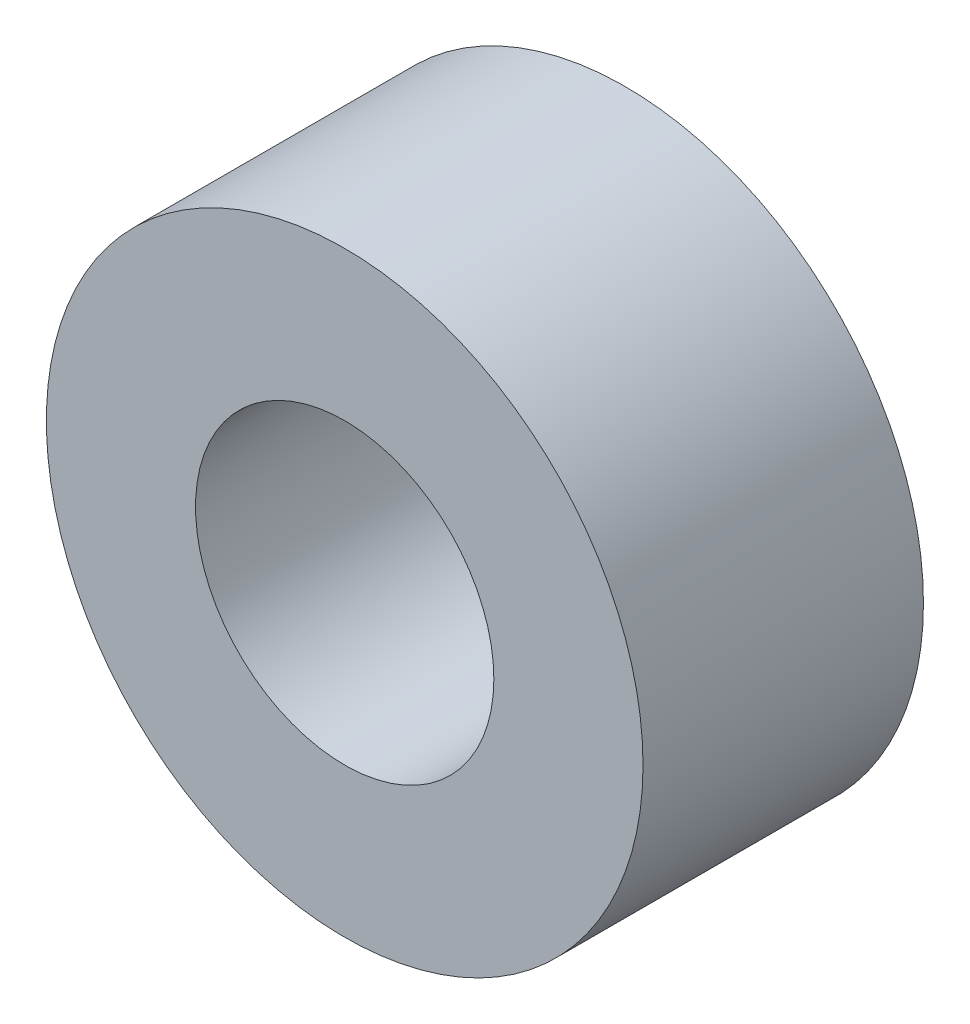
ISO-10303-21;
HEADER;
FILE_DESCRIPTION(('STEP AP214'),'2;1');
FILE_NAME('part.step','',(''),(''),'','','');
FILE_SCHEMA(('AUTOMOTIVE_DESIGN { 1 0 10303 214 1 1 1 1 }'));
ENDSEC;
DATA;
#1=APPLICATION_CONTEXT('core data for automotive mechanical design processes');
#2=APPLICATION_PROTOCOL_DEFINITION('international standard','automotive_design',2000,#1);
#3=PRODUCT_CONTEXT('',#1,'mechanical');
#4=PRODUCT('Part','Part','',(#3));
#5=PRODUCT_RELATED_PRODUCT_CATEGORY('part','',(#4));
#6=PRODUCT_DEFINITION_FORMATION('','',#4);
#7=PRODUCT_DEFINITION_CONTEXT('part definition',#1,'design');
#8=PRODUCT_DEFINITION('design','',#6,#7);
#9=PRODUCT_DEFINITION_SHAPE('','',#8);
#10=(LENGTH_UNIT() NAMED_UNIT(*) SI_UNIT(.MILLI.,.METRE.));
#11=(NAMED_UNIT(*) PLANE_ANGLE_UNIT() SI_UNIT($,.RADIAN.));
#12=(NAMED_UNIT(*) SI_UNIT($,.STERADIAN.) SOLID_ANGLE_UNIT());
#13=UNCERTAINTY_MEASURE_WITH_UNIT(LENGTH_MEASURE(1.E-05),#10,'distance_accuracy_value','');
#14=(GEOMETRIC_REPRESENTATION_CONTEXT(3) GLOBAL_UNCERTAINTY_ASSIGNED_CONTEXT((#13)) GLOBAL_UNIT_ASSIGNED_CONTEXT((#10,
#11,#12)) REPRESENTATION_CONTEXT('',''));
#15=CARTESIAN_POINT('',(0.,0.,0.));
#16=DIRECTION('',(0.,0.,1.));
#17=DIRECTION('',(1.,0.,0.));
#18=AXIS2_PLACEMENT_3D('',#15,#16,#17);
#19=CARTESIAN_POINT('',(0.,0.,2.9845));
#20=DIRECTION('',(0.,0.,1.));
#21=DIRECTION('',(1.,0.,0.));
#22=AXIS2_PLACEMENT_3D('',#19,#20,#21);
#23=PLANE('',#22);
#24=CARTESIAN_POINT('',(0.,0.,2.9845));
#25=DIRECTION('',(0.,0.,1.));
#26=DIRECTION('',(1.,0.,0.));
#27=AXIS2_PLACEMENT_3D('',#24,#25,#26);
#28=CIRCLE('',#27,3.175);
#29=CARTESIAN_POINT('',(3.175,0.,2.9845));
#30=VERTEX_POINT('',#29);
#31=EDGE_CURVE('E11',#30,#30,#28,.T.);
#32=ORIENTED_EDGE('',*,*,#31,.T.);
#33=EDGE_LOOP('',(#32));
#34=FACE_BOUND('',#33,.T.);
#35=CARTESIAN_POINT('',(0.,0.,2.9845));
#36=DIRECTION('',(0.,0.,1.));
#37=DIRECTION('',(1.,0.,0.));
#38=AXIS2_PLACEMENT_3D('',#35,#36,#37);
#39=CIRCLE('',#38,1.5875);
#40=CARTESIAN_POINT('',(1.5875,0.,2.9845));
#41=VERTEX_POINT('',#40);
#42=EDGE_CURVE('E56',#41,#41,#39,.T.);
#43=ORIENTED_EDGE('',*,*,#42,.F.);
#44=EDGE_LOOP('',(#43));
#45=FACE_BOUND('',#44,.T.);
#46=ADVANCED_FACE('F43',(#34,#45),#23,.T.);
#47=CARTESIAN_POINT('',(0.,0.,0.));
#48=DIRECTION('',(0.,0.,1.));
#49=DIRECTION('',(1.,0.,0.));
#50=AXIS2_PLACEMENT_3D('',#47,#48,#49);
#51=PLANE('',#50);
#52=CARTESIAN_POINT('',(0.,0.,0.));
#53=DIRECTION('',(0.,0.,1.));
#54=DIRECTION('',(1.,0.,0.));
#55=AXIS2_PLACEMENT_3D('',#52,#53,#54);
#56=CIRCLE('',#55,3.175);
#57=CARTESIAN_POINT('',(3.175,0.,0.));
#58=VERTEX_POINT('',#57);
#59=EDGE_CURVE('E47',#58,#58,#56,.T.);
#60=ORIENTED_EDGE('',*,*,#59,.F.);
#61=EDGE_LOOP('',(#60));
#62=FACE_BOUND('',#61,.T.);
#63=CARTESIAN_POINT('',(0.,0.,0.));
#64=DIRECTION('',(0.,0.,1.));
#65=DIRECTION('',(1.,0.,0.));
#66=AXIS2_PLACEMENT_3D('',#63,#64,#65);
#67=CIRCLE('',#66,1.5875);
#68=CARTESIAN_POINT('',(1.5875,0.,0.));
#69=VERTEX_POINT('',#68);
#70=EDGE_CURVE('E58',#69,#69,#67,.T.);
#71=ORIENTED_EDGE('',*,*,#70,.T.);
#72=EDGE_LOOP('',(#71));
#73=FACE_BOUND('',#72,.T.);
#74=ADVANCED_FACE('F70',(#62,#73),#51,.F.);
#75=CARTESIAN_POINT('',(0.,0.,2.9845));
#76=DIRECTION('',(0.,0.,-1.));
#77=DIRECTION('',(-1.,0.,0.));
#78=AXIS2_PLACEMENT_3D('',#75,#76,#77);
#79=CYLINDRICAL_SURFACE('',#78,3.175);
#80=ORIENTED_EDGE('',*,*,#31,.F.);
#81=EDGE_LOOP('',(#80));
#82=FACE_BOUND('',#81,.T.);
#83=ORIENTED_EDGE('',*,*,#59,.T.);
#84=EDGE_LOOP('',(#83));
#85=FACE_BOUND('',#84,.T.);
#86=ADVANCED_FACE('F45',(#82,#85),#79,.T.);
#87=CARTESIAN_POINT('',(0.,0.,2.9845));
#88=DIRECTION('',(0.,0.,-1.));
#89=DIRECTION('',(-1.,0.,0.));
#90=AXIS2_PLACEMENT_3D('',#87,#88,#89);
#91=CYLINDRICAL_SURFACE('',#90,1.5875);
#92=ORIENTED_EDGE('',*,*,#42,.T.);
#93=EDGE_LOOP('',(#92));
#94=FACE_BOUND('',#93,.T.);
#95=ORIENTED_EDGE('',*,*,#70,.F.);
#96=EDGE_LOOP('',(#95));
#97=FACE_BOUND('',#96,.T.);
#98=ADVANCED_FACE('F66',(#94,#97),#91,.F.);
#99=CLOSED_SHELL('',(#46,#74,#86,#98));
#100=MANIFOLD_SOLID_BREP('B2',#99);
#101=ADVANCED_BREP_SHAPE_REPRESENTATION('',(#18,#100),#14);
#102=SHAPE_DEFINITION_REPRESENTATION(#9,#101);
ENDSEC;
END-ISO-10303-21;
